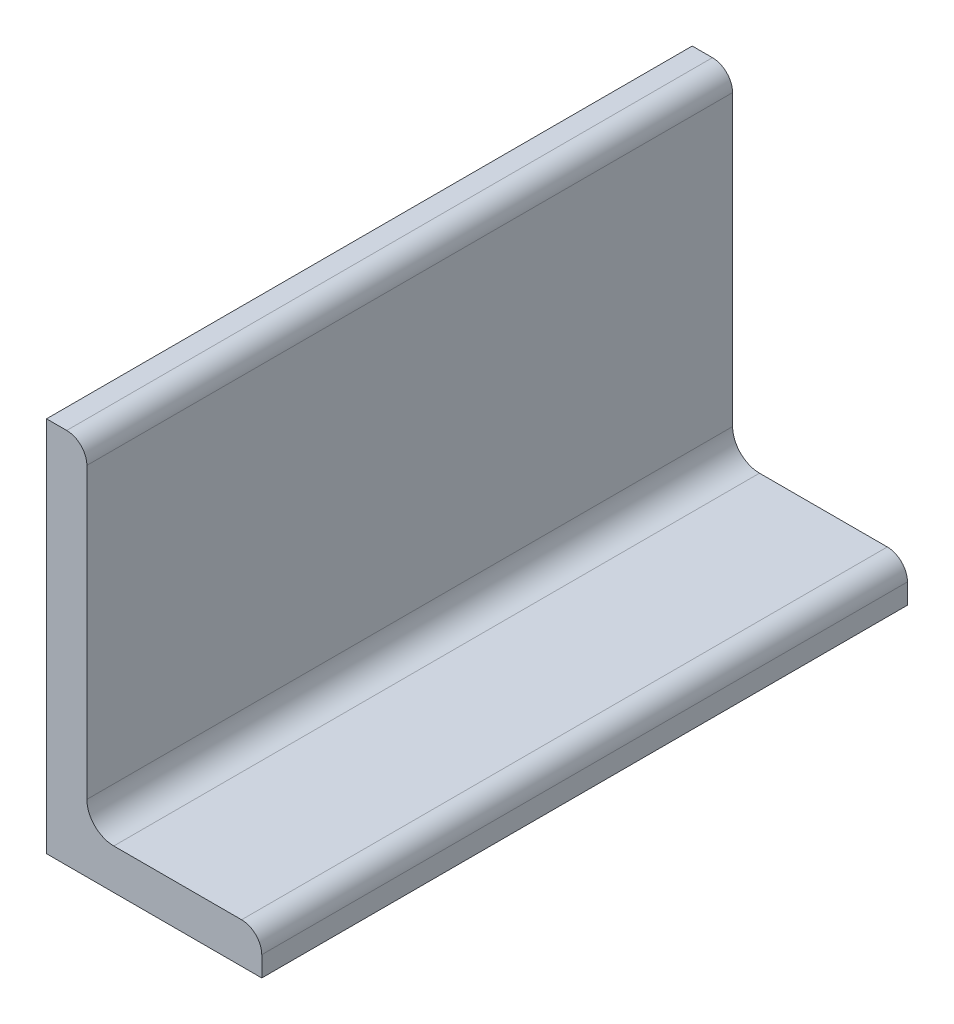
ISO-10303-21;
HEADER;
FILE_DESCRIPTION(('STEP AP214'),'2;1');
FILE_NAME('part.step','',(''),(''),'','','');
FILE_SCHEMA(('AUTOMOTIVE_DESIGN { 1 0 10303 214 1 1 1 1 }'));
ENDSEC;
DATA;
#1=APPLICATION_CONTEXT('core data for automotive mechanical design processes');
#2=APPLICATION_PROTOCOL_DEFINITION('international standard','automotive_design',2000,#1);
#3=PRODUCT_CONTEXT('',#1,'mechanical');
#4=PRODUCT('Part','Part','',(#3));
#5=PRODUCT_RELATED_PRODUCT_CATEGORY('part','',(#4));
#6=PRODUCT_DEFINITION_FORMATION('','',#4);
#7=PRODUCT_DEFINITION_CONTEXT('part definition',#1,'design');
#8=PRODUCT_DEFINITION('design','',#6,#7);
#9=PRODUCT_DEFINITION_SHAPE('','',#8);
#10=(LENGTH_UNIT() NAMED_UNIT(*) SI_UNIT(.MILLI.,.METRE.));
#11=(NAMED_UNIT(*) PLANE_ANGLE_UNIT() SI_UNIT($,.RADIAN.));
#12=(NAMED_UNIT(*) SI_UNIT($,.STERADIAN.) SOLID_ANGLE_UNIT());
#13=UNCERTAINTY_MEASURE_WITH_UNIT(LENGTH_MEASURE(1.E-05),#10,'distance_accuracy_value','');
#14=(GEOMETRIC_REPRESENTATION_CONTEXT(3) GLOBAL_UNCERTAINTY_ASSIGNED_CONTEXT((#13)) GLOBAL_UNIT_ASSIGNED_CONTEXT((#10,
#11,#12)) REPRESENTATION_CONTEXT('',''));
#15=CARTESIAN_POINT('',(0.,0.,0.));
#16=DIRECTION('',(0.,0.,1.));
#17=DIRECTION('',(1.,0.,0.));
#18=AXIS2_PLACEMENT_3D('',#15,#16,#17);
#19=CARTESIAN_POINT('',(0.865045893659089,178.809200992538,304.8));
#20=DIRECTION('',(1.,0.,0.));
#21=DIRECTION('',(0.,0.,-1.));
#22=AXIS2_PLACEMENT_3D('',#19,#20,#21);
#23=PLANE('',#22);
#24=DIRECTION('',(0.,-1.,0.));
#25=VECTOR('',#24,1.);
#26=CARTESIAN_POINT('',(0.865045893659089,178.809200992538,0.));
#27=LINE('',#26,#25);
#28=CARTESIAN_POINT('',(0.865045893659089,178.809200992538,0.));
#29=VERTEX_POINT('',#28);
#30=CARTESIAN_POINT('',(0.865045893659089,1.00920099253849,0.));
#31=VERTEX_POINT('',#30);
#32=EDGE_CURVE('E135',#29,#31,#27,.T.);
#33=ORIENTED_EDGE('',*,*,#32,.T.);
#34=DIRECTION('',(0.,0.,-1.));
#35=VECTOR('',#34,1.);
#36=CARTESIAN_POINT('',(0.865045893659089,1.00920099253849,304.8));
#37=LINE('',#36,#35);
#38=CARTESIAN_POINT('',(0.865045893659089,1.00920099253849,304.8));
#39=VERTEX_POINT('',#38);
#40=EDGE_CURVE('E11',#39,#31,#37,.T.);
#41=ORIENTED_EDGE('',*,*,#40,.F.);
#42=DIRECTION('',(0.,-1.,0.));
#43=VECTOR('',#42,1.);
#44=CARTESIAN_POINT('',(0.865045893659089,178.809200992538,304.8));
#45=LINE('',#44,#43);
#46=CARTESIAN_POINT('',(0.865045893659089,178.809200992538,304.8));
#47=VERTEX_POINT('',#46);
#48=EDGE_CURVE('E151',#47,#39,#45,.T.);
#49=ORIENTED_EDGE('',*,*,#48,.F.);
#50=DIRECTION('',(0.,0.,-1.));
#51=VECTOR('',#50,1.);
#52=CARTESIAN_POINT('',(0.865045893659089,178.809200992538,304.8));
#53=LINE('',#52,#51);
#54=EDGE_CURVE('E131',#47,#29,#53,.T.);
#55=ORIENTED_EDGE('',*,*,#54,.T.);
#56=EDGE_LOOP('',(#33,#41,#49,#55));
#57=FACE_BOUND('',#56,.T.);
#58=ADVANCED_FACE('F33',(#57),#23,.F.);
#59=CARTESIAN_POINT('',(0.865045893659089,1.00920099253849,304.8));
#60=DIRECTION('',(0.,1.,0.));
#61=DIRECTION('',(0.,0.,1.));
#62=AXIS2_PLACEMENT_3D('',#59,#60,#61);
#63=PLANE('',#62);
#64=DIRECTION('',(1.,0.,0.));
#65=VECTOR('',#64,1.);
#66=CARTESIAN_POINT('',(0.865045893659089,1.00920099253849,0.));
#67=LINE('',#66,#65);
#68=CARTESIAN_POINT('',(102.465045893659,1.00920099253849,0.));
#69=VERTEX_POINT('',#68);
#70=EDGE_CURVE('E138',#31,#69,#67,.T.);
#71=ORIENTED_EDGE('',*,*,#70,.T.);
#72=DIRECTION('',(0.,0.,-1.));
#73=VECTOR('',#72,1.);
#74=CARTESIAN_POINT('',(102.465045893659,1.00920099253849,304.8));
#75=LINE('',#74,#73);
#76=CARTESIAN_POINT('',(102.465045893659,1.00920099253849,304.8));
#77=VERTEX_POINT('',#76);
#78=EDGE_CURVE('E41',#77,#69,#75,.T.);
#79=ORIENTED_EDGE('',*,*,#78,.F.);
#80=DIRECTION('',(1.,0.,0.));
#81=VECTOR('',#80,1.);
#82=CARTESIAN_POINT('',(0.865045893659089,1.00920099253849,304.8));
#83=LINE('',#82,#81);
#84=EDGE_CURVE('E95',#39,#77,#83,.T.);
#85=ORIENTED_EDGE('',*,*,#84,.F.);
#86=ORIENTED_EDGE('',*,*,#40,.T.);
#87=EDGE_LOOP('',(#71,#79,#85,#86));
#88=FACE_BOUND('',#87,.T.);
#89=ADVANCED_FACE('F194',(#88),#63,.F.);
#90=CARTESIAN_POINT('',(102.465045893659,1.00920099253849,304.8));
#91=DIRECTION('',(-1.,0.,0.));
#92=DIRECTION('',(0.,0.,1.));
#93=AXIS2_PLACEMENT_3D('',#90,#91,#92);
#94=PLANE('',#93);
#95=DIRECTION('',(0.,1.,0.));
#96=VECTOR('',#95,1.);
#97=CARTESIAN_POINT('',(102.465045893659,1.00920099253849,0.));
#98=LINE('',#97,#96);
#99=CARTESIAN_POINT('',(102.465045893659,10.5342009925385,0.));
#100=VERTEX_POINT('',#99);
#101=EDGE_CURVE('E140',#69,#100,#98,.T.);
#102=ORIENTED_EDGE('',*,*,#101,.T.);
#103=DIRECTION('',(0.,0.,-1.));
#104=VECTOR('',#103,1.);
#105=CARTESIAN_POINT('',(102.465045893659,10.5342009925385,304.8));
#106=LINE('',#105,#104);
#107=CARTESIAN_POINT('',(102.465045893659,10.5342009925385,304.8));
#108=VERTEX_POINT('',#107);
#109=EDGE_CURVE('E161',#108,#100,#106,.T.);
#110=ORIENTED_EDGE('',*,*,#109,.F.);
#111=DIRECTION('',(0.,1.,0.));
#112=VECTOR('',#111,1.);
#113=CARTESIAN_POINT('',(102.465045893659,1.00920099253849,304.8));
#114=LINE('',#113,#112);
#115=EDGE_CURVE('E169',#77,#108,#114,.T.);
#116=ORIENTED_EDGE('',*,*,#115,.F.);
#117=ORIENTED_EDGE('',*,*,#78,.T.);
#118=EDGE_LOOP('',(#102,#110,#116,#117));
#119=FACE_BOUND('',#118,.T.);
#120=ADVANCED_FACE('F167',(#119),#94,.F.);
#121=CARTESIAN_POINT('',(92.9400458936591,10.5342009925385,304.8));
#122=DIRECTION('',(0.,0.,-1.));
#123=DIRECTION('',(-1.,0.,0.));
#124=AXIS2_PLACEMENT_3D('',#121,#122,#123);
#125=CYLINDRICAL_SURFACE('',#124,9.52500000000001);
#126=CARTESIAN_POINT('',(92.9400458936591,10.5342009925385,0.));
#127=DIRECTION('',(0.,0.,1.));
#128=DIRECTION('',(1.,0.,0.));
#129=AXIS2_PLACEMENT_3D('',#126,#127,#128);
#130=CIRCLE('',#129,9.52500000000001);
#131=CARTESIAN_POINT('',(92.9400458936591,20.0592009925385,0.));
#132=VERTEX_POINT('',#131);
#133=EDGE_CURVE('E142',#100,#132,#130,.T.);
#134=ORIENTED_EDGE('',*,*,#133,.T.);
#135=DIRECTION('',(0.,0.,-1.));
#136=VECTOR('',#135,1.);
#137=CARTESIAN_POINT('',(92.9400458936591,20.0592009925385,304.8));
#138=LINE('',#137,#136);
#139=CARTESIAN_POINT('',(92.9400458936591,20.0592009925385,304.8));
#140=VERTEX_POINT('',#139);
#141=EDGE_CURVE('E158',#140,#132,#138,.T.);
#142=ORIENTED_EDGE('',*,*,#141,.F.);
#143=CARTESIAN_POINT('',(92.9400458936591,10.5342009925385,304.8));
#144=DIRECTION('',(0.,0.,1.));
#145=DIRECTION('',(1.,0.,0.));
#146=AXIS2_PLACEMENT_3D('',#143,#144,#145);
#147=CIRCLE('',#146,9.52500000000001);
#148=EDGE_CURVE('E185',#108,#140,#147,.T.);
#149=ORIENTED_EDGE('',*,*,#148,.F.);
#150=ORIENTED_EDGE('',*,*,#109,.T.);
#151=EDGE_LOOP('',(#134,#142,#149,#150));
#152=FACE_BOUND('',#151,.T.);
#153=ADVANCED_FACE('F178',(#152),#125,.T.);
#154=CARTESIAN_POINT('',(92.9400458936591,20.0592009925385,304.8));
#155=DIRECTION('',(0.,-1.,0.));
#156=DIRECTION('',(0.,0.,-1.));
#157=AXIS2_PLACEMENT_3D('',#154,#155,#156);
#158=PLANE('',#157);
#159=DIRECTION('',(-1.,0.,0.));
#160=VECTOR('',#159,1.);
#161=CARTESIAN_POINT('',(92.9400458936591,20.0592009925385,0.));
#162=LINE('',#161,#160);
#163=CARTESIAN_POINT('',(32.6150458936591,20.0592009925385,0.));
#164=VERTEX_POINT('',#163);
#165=EDGE_CURVE('E144',#132,#164,#162,.T.);
#166=ORIENTED_EDGE('',*,*,#165,.T.);
#167=DIRECTION('',(0.,0.,-1.));
#168=VECTOR('',#167,1.);
#169=CARTESIAN_POINT('',(32.6150458936591,20.0592009925385,304.8));
#170=LINE('',#169,#168);
#171=CARTESIAN_POINT('',(32.6150458936591,20.0592009925385,304.8));
#172=VERTEX_POINT('',#171);
#173=EDGE_CURVE('E155',#172,#164,#170,.T.);
#174=ORIENTED_EDGE('',*,*,#173,.F.);
#175=DIRECTION('',(-1.,0.,0.));
#176=VECTOR('',#175,1.);
#177=CARTESIAN_POINT('',(92.9400458936591,20.0592009925385,304.8));
#178=LINE('',#177,#176);
#179=EDGE_CURVE('E184',#140,#172,#178,.T.);
#180=ORIENTED_EDGE('',*,*,#179,.F.);
#181=ORIENTED_EDGE('',*,*,#141,.T.);
#182=EDGE_LOOP('',(#166,#174,#180,#181));
#183=FACE_BOUND('',#182,.T.);
#184=ADVANCED_FACE('F182',(#183),#158,.F.);
#185=CARTESIAN_POINT('',(32.6150458936591,32.7592009925385,304.8));
#186=DIRECTION('',(0.,0.,-1.));
#187=DIRECTION('',(-1.,0.,0.));
#188=AXIS2_PLACEMENT_3D('',#185,#186,#187);
#189=CYLINDRICAL_SURFACE('',#188,12.7);
#190=CARTESIAN_POINT('',(32.6150458936591,32.7592009925385,0.));
#191=DIRECTION('',(0.,0.,-1.));
#192=DIRECTION('',(1.,0.,0.));
#193=AXIS2_PLACEMENT_3D('',#190,#191,#192);
#194=CIRCLE('',#193,12.7);
#195=CARTESIAN_POINT('',(19.9150458936591,32.7592009925385,0.));
#196=VERTEX_POINT('',#195);
#197=EDGE_CURVE('E146',#164,#196,#194,.T.);
#198=ORIENTED_EDGE('',*,*,#197,.T.);
#199=DIRECTION('',(0.,0.,-1.));
#200=VECTOR('',#199,1.);
#201=CARTESIAN_POINT('',(19.9150458936591,32.7592009925385,304.8));
#202=LINE('',#201,#200);
#203=CARTESIAN_POINT('',(19.9150458936591,32.7592009925385,304.8));
#204=VERTEX_POINT('',#203);
#205=EDGE_CURVE('E126',#204,#196,#202,.T.);
#206=ORIENTED_EDGE('',*,*,#205,.F.);
#207=CARTESIAN_POINT('',(32.6150458936591,32.7592009925385,304.8));
#208=DIRECTION('',(0.,0.,-1.));
#209=DIRECTION('',(1.,0.,0.));
#210=AXIS2_PLACEMENT_3D('',#207,#208,#209);
#211=CIRCLE('',#210,12.7);
#212=EDGE_CURVE('E117',#172,#204,#211,.T.);
#213=ORIENTED_EDGE('',*,*,#212,.F.);
#214=ORIENTED_EDGE('',*,*,#173,.T.);
#215=EDGE_LOOP('',(#198,#206,#213,#214));
#216=FACE_BOUND('',#215,.T.);
#217=ADVANCED_FACE('F206',(#216),#189,.F.);
#218=CARTESIAN_POINT('',(19.9150458936591,32.7592009925385,304.8));
#219=DIRECTION('',(-1.,0.,0.));
#220=DIRECTION('',(0.,0.,1.));
#221=AXIS2_PLACEMENT_3D('',#218,#219,#220);
#222=PLANE('',#221);
#223=DIRECTION('',(0.,1.,0.));
#224=VECTOR('',#223,1.);
#225=CARTESIAN_POINT('',(19.9150458936591,32.7592009925385,0.));
#226=LINE('',#225,#224);
#227=CARTESIAN_POINT('',(19.9150458936591,169.284200992539,0.));
#228=VERTEX_POINT('',#227);
#229=EDGE_CURVE('E125',#196,#228,#226,.T.);
#230=ORIENTED_EDGE('',*,*,#229,.T.);
#231=DIRECTION('',(0.,0.,-1.));
#232=VECTOR('',#231,1.);
#233=CARTESIAN_POINT('',(19.9150458936591,169.284200992539,304.8));
#234=LINE('',#233,#232);
#235=CARTESIAN_POINT('',(19.9150458936591,169.284200992539,304.8));
#236=VERTEX_POINT('',#235);
#237=EDGE_CURVE('E122',#236,#228,#234,.T.);
#238=ORIENTED_EDGE('',*,*,#237,.F.);
#239=DIRECTION('',(0.,1.,0.));
#240=VECTOR('',#239,1.);
#241=CARTESIAN_POINT('',(19.9150458936591,32.7592009925385,304.8));
#242=LINE('',#241,#240);
#243=EDGE_CURVE('E111',#204,#236,#242,.T.);
#244=ORIENTED_EDGE('',*,*,#243,.F.);
#245=ORIENTED_EDGE('',*,*,#205,.T.);
#246=EDGE_LOOP('',(#230,#238,#244,#245));
#247=FACE_BOUND('',#246,.T.);
#248=ADVANCED_FACE('F123',(#247),#222,.F.);
#249=CARTESIAN_POINT('',(10.3900458936591,169.284200992539,304.8));
#250=DIRECTION('',(0.,0.,-1.));
#251=DIRECTION('',(-1.,0.,0.));
#252=AXIS2_PLACEMENT_3D('',#249,#250,#251);
#253=CYLINDRICAL_SURFACE('',#252,9.52499999999998);
#254=CARTESIAN_POINT('',(10.3900458936591,169.284200992539,0.));
#255=DIRECTION('',(0.,0.,1.));
#256=DIRECTION('',(1.,0.,0.));
#257=AXIS2_PLACEMENT_3D('',#254,#255,#256);
#258=CIRCLE('',#257,9.52499999999998);
#259=CARTESIAN_POINT('',(10.3900458936591,178.809200992538,0.));
#260=VERTEX_POINT('',#259);
#261=EDGE_CURVE('E81',#228,#260,#258,.T.);
#262=ORIENTED_EDGE('',*,*,#261,.T.);
#263=DIRECTION('',(0.,0.,-1.));
#264=VECTOR('',#263,1.);
#265=CARTESIAN_POINT('',(10.3900458936591,178.809200992538,304.8));
#266=LINE('',#265,#264);
#267=CARTESIAN_POINT('',(10.3900458936591,178.809200992538,304.8));
#268=VERTEX_POINT('',#267);
#269=EDGE_CURVE('E127',#268,#260,#266,.T.);
#270=ORIENTED_EDGE('',*,*,#269,.F.);
#271=CARTESIAN_POINT('',(10.3900458936591,169.284200992539,304.8));
#272=DIRECTION('',(0.,0.,1.));
#273=DIRECTION('',(1.,0.,0.));
#274=AXIS2_PLACEMENT_3D('',#271,#272,#273);
#275=CIRCLE('',#274,9.52499999999998);
#276=EDGE_CURVE('E115',#236,#268,#275,.T.);
#277=ORIENTED_EDGE('',*,*,#276,.F.);
#278=ORIENTED_EDGE('',*,*,#237,.T.);
#279=EDGE_LOOP('',(#262,#270,#277,#278));
#280=FACE_BOUND('',#279,.T.);
#281=ADVANCED_FACE('F129',(#280),#253,.T.);
#282=CARTESIAN_POINT('',(10.3900458936591,178.809200992538,304.8));
#283=DIRECTION('',(0.,-1.,0.));
#284=DIRECTION('',(0.,0.,-1.));
#285=AXIS2_PLACEMENT_3D('',#282,#283,#284);
#286=PLANE('',#285);
#287=DIRECTION('',(-1.,0.,0.));
#288=VECTOR('',#287,1.);
#289=CARTESIAN_POINT('',(10.3900458936591,178.809200992538,0.));
#290=LINE('',#289,#288);
#291=EDGE_CURVE('E87',#260,#29,#290,.T.);
#292=ORIENTED_EDGE('',*,*,#291,.T.);
#293=ORIENTED_EDGE('',*,*,#54,.F.);
#294=DIRECTION('',(-1.,0.,0.));
#295=VECTOR('',#294,1.);
#296=CARTESIAN_POINT('',(10.3900458936591,178.809200992538,304.8));
#297=LINE('',#296,#295);
#298=EDGE_CURVE('E49',#268,#47,#297,.T.);
#299=ORIENTED_EDGE('',*,*,#298,.F.);
#300=ORIENTED_EDGE('',*,*,#269,.T.);
#301=EDGE_LOOP('',(#292,#293,#299,#300));
#302=FACE_BOUND('',#301,.T.);
#303=ADVANCED_FACE('F214',(#302),#286,.F.);
#304=CARTESIAN_POINT('',(92.9400458936591,10.5342009925385,304.8));
#305=DIRECTION('',(0.,0.,1.));
#306=DIRECTION('',(1.,0.,0.));
#307=AXIS2_PLACEMENT_3D('',#304,#305,#306);
#308=PLANE('',#307);
#309=ORIENTED_EDGE('',*,*,#48,.T.);
#310=ORIENTED_EDGE('',*,*,#84,.T.);
#311=ORIENTED_EDGE('',*,*,#115,.T.);
#312=ORIENTED_EDGE('',*,*,#148,.T.);
#313=ORIENTED_EDGE('',*,*,#179,.T.);
#314=ORIENTED_EDGE('',*,*,#212,.T.);
#315=ORIENTED_EDGE('',*,*,#243,.T.);
#316=ORIENTED_EDGE('',*,*,#276,.T.);
#317=ORIENTED_EDGE('',*,*,#298,.T.);
#318=EDGE_LOOP('',(#309,#310,#311,#312,#313,#314,#315,#316,#317));
#319=FACE_BOUND('',#318,.T.);
#320=ADVANCED_FACE('F113',(#319),#308,.T.);
#321=CARTESIAN_POINT('',(92.9400458936591,10.5342009925385,0.));
#322=DIRECTION('',(0.,0.,1.));
#323=DIRECTION('',(1.,0.,0.));
#324=AXIS2_PLACEMENT_3D('',#321,#322,#323);
#325=PLANE('',#324);
#326=ORIENTED_EDGE('',*,*,#32,.F.);
#327=ORIENTED_EDGE('',*,*,#291,.F.);
#328=ORIENTED_EDGE('',*,*,#261,.F.);
#329=ORIENTED_EDGE('',*,*,#229,.F.);
#330=ORIENTED_EDGE('',*,*,#197,.F.);
#331=ORIENTED_EDGE('',*,*,#165,.F.);
#332=ORIENTED_EDGE('',*,*,#133,.F.);
#333=ORIENTED_EDGE('',*,*,#101,.F.);
#334=ORIENTED_EDGE('',*,*,#70,.F.);
#335=EDGE_LOOP('',(#326,#327,#328,#329,#330,#331,#332,#333,#334));
#336=FACE_BOUND('',#335,.T.);
#337=ADVANCED_FACE('F173',(#336),#325,.F.);
#338=CLOSED_SHELL('',(#58,#89,#120,#153,#184,#217,#248,#281,#303,#320,#337));
#339=MANIFOLD_SOLID_BREP('B2',#338);
#340=ADVANCED_BREP_SHAPE_REPRESENTATION('',(#18,#339),#14);
#341=SHAPE_DEFINITION_REPRESENTATION(#9,#340);
ENDSEC;
END-ISO-10303-21;
